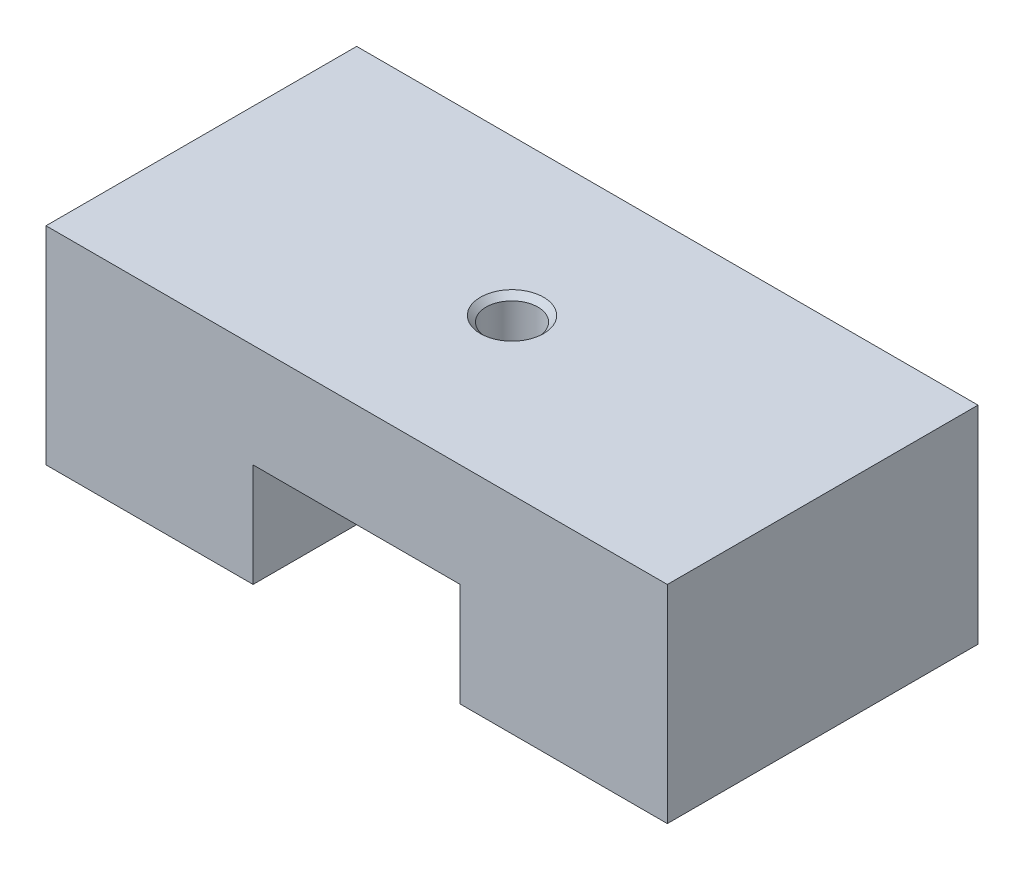
ISO-10303-21;
HEADER;
FILE_DESCRIPTION(('STEP AP214'),'2;1');
FILE_NAME('part.step','',(''),(''),'','','');
FILE_SCHEMA(('AUTOMOTIVE_DESIGN { 1 0 10303 214 1 1 1 1 }'));
ENDSEC;
DATA;
#1=APPLICATION_CONTEXT('core data for automotive mechanical design processes');
#2=APPLICATION_PROTOCOL_DEFINITION('international standard','automotive_design',2000,#1);
#3=PRODUCT_CONTEXT('',#1,'mechanical');
#4=PRODUCT('Part','Part','',(#3));
#5=PRODUCT_RELATED_PRODUCT_CATEGORY('part','',(#4));
#6=PRODUCT_DEFINITION_FORMATION('','',#4);
#7=PRODUCT_DEFINITION_CONTEXT('part definition',#1,'design');
#8=PRODUCT_DEFINITION('design','',#6,#7);
#9=PRODUCT_DEFINITION_SHAPE('','',#8);
#10=(LENGTH_UNIT() NAMED_UNIT(*) SI_UNIT(.MILLI.,.METRE.));
#11=(NAMED_UNIT(*) PLANE_ANGLE_UNIT() SI_UNIT($,.RADIAN.));
#12=(NAMED_UNIT(*) SI_UNIT($,.STERADIAN.) SOLID_ANGLE_UNIT());
#13=UNCERTAINTY_MEASURE_WITH_UNIT(LENGTH_MEASURE(1.E-05),#10,'distance_accuracy_value','');
#14=(GEOMETRIC_REPRESENTATION_CONTEXT(3) GLOBAL_UNCERTAINTY_ASSIGNED_CONTEXT((#13)) GLOBAL_UNIT_ASSIGNED_CONTEXT((#10,
#11,#12)) REPRESENTATION_CONTEXT('',''));
#15=CARTESIAN_POINT('',(0.,0.,0.));
#16=DIRECTION('',(0.,0.,1.));
#17=DIRECTION('',(1.,0.,0.));
#18=AXIS2_PLACEMENT_3D('',#15,#16,#17);
#19=CARTESIAN_POINT('',(15.,0.,15.));
#20=DIRECTION('',(-1.,0.,0.));
#21=DIRECTION('',(0.,-1.,0.));
#22=AXIS2_PLACEMENT_3D('',#19,#20,#21);
#23=PLANE('',#22);
#24=DIRECTION('',(0.,1.,0.));
#25=VECTOR('',#24,1.);
#26=CARTESIAN_POINT('',(15.,0.,0.));
#27=LINE('',#26,#25);
#28=CARTESIAN_POINT('',(15.,-10.,0.));
#29=VERTEX_POINT('',#28);
#30=CARTESIAN_POINT('',(15.,0.,0.));
#31=VERTEX_POINT('',#30);
#32=EDGE_CURVE('E130',#29,#31,#27,.T.);
#33=ORIENTED_EDGE('',*,*,#32,.T.);
#34=DIRECTION('',(0.,0.,-1.));
#35=VECTOR('',#34,1.);
#36=CARTESIAN_POINT('',(15.,0.,15.));
#37=LINE('',#36,#35);
#38=CARTESIAN_POINT('',(15.,0.,15.));
#39=VERTEX_POINT('',#38);
#40=EDGE_CURVE('E11',#39,#31,#37,.T.);
#41=ORIENTED_EDGE('',*,*,#40,.F.);
#42=DIRECTION('',(0.,1.,0.));
#43=VECTOR('',#42,1.);
#44=CARTESIAN_POINT('',(15.,0.,15.));
#45=LINE('',#44,#43);
#46=CARTESIAN_POINT('',(15.,-10.,15.));
#47=VERTEX_POINT('',#46);
#48=EDGE_CURVE('E144',#47,#39,#45,.T.);
#49=ORIENTED_EDGE('',*,*,#48,.F.);
#50=DIRECTION('',(0.,0.,-1.));
#51=VECTOR('',#50,1.);
#52=CARTESIAN_POINT('',(15.,-10.,15.));
#53=LINE('',#52,#51);
#54=EDGE_CURVE('E126',#47,#29,#53,.T.);
#55=ORIENTED_EDGE('',*,*,#54,.T.);
#56=EDGE_LOOP('',(#33,#41,#49,#55));
#57=FACE_BOUND('',#56,.T.);
#58=ADVANCED_FACE('F33',(#57),#23,.F.);
#59=CARTESIAN_POINT('',(-15.,0.,15.));
#60=DIRECTION('',(0.,-1.,0.));
#61=DIRECTION('',(0.,0.,-1.));
#62=AXIS2_PLACEMENT_3D('',#59,#60,#61);
#63=PLANE('',#62);
#64=CARTESIAN_POINT('',(0.,0.,7.5));
#65=DIRECTION('',(0.,1.,0.));
#66=DIRECTION('',(0.,0.,1.));
#67=AXIS2_PLACEMENT_3D('',#64,#65,#66);
#68=CIRCLE('',#67,1.525);
#69=CARTESIAN_POINT('',(0.,0.,9.025));
#70=VERTEX_POINT('',#69);
#71=EDGE_CURVE('E181',#70,#70,#68,.T.);
#72=ORIENTED_EDGE('',*,*,#71,.F.);
#73=EDGE_LOOP('',(#72));
#74=FACE_BOUND('',#73,.T.);
#75=DIRECTION('',(-1.,0.,0.));
#76=VECTOR('',#75,1.);
#77=CARTESIAN_POINT('',(-15.,0.,0.));
#78=LINE('',#77,#76);
#79=CARTESIAN_POINT('',(-15.,0.,0.));
#80=VERTEX_POINT('',#79);
#81=EDGE_CURVE('E133',#31,#80,#78,.T.);
#82=ORIENTED_EDGE('',*,*,#81,.T.);
#83=DIRECTION('',(0.,0.,-1.));
#84=VECTOR('',#83,1.);
#85=CARTESIAN_POINT('',(-15.,0.,15.));
#86=LINE('',#85,#84);
#87=CARTESIAN_POINT('',(-15.,0.,15.));
#88=VERTEX_POINT('',#87);
#89=EDGE_CURVE('E42',#88,#80,#86,.T.);
#90=ORIENTED_EDGE('',*,*,#89,.F.);
#91=DIRECTION('',(-1.,0.,0.));
#92=VECTOR('',#91,1.);
#93=CARTESIAN_POINT('',(-15.,0.,15.));
#94=LINE('',#93,#92);
#95=EDGE_CURVE('E93',#39,#88,#94,.T.);
#96=ORIENTED_EDGE('',*,*,#95,.F.);
#97=ORIENTED_EDGE('',*,*,#40,.T.);
#98=EDGE_LOOP('',(#82,#90,#96,#97));
#99=FACE_BOUND('',#98,.T.);
#100=ADVANCED_FACE('F187',(#74,#99),#63,.F.);
#101=CARTESIAN_POINT('',(-15.,0.,15.));
#102=DIRECTION('',(1.,0.,0.));
#103=DIRECTION('',(0.,1.,0.));
#104=AXIS2_PLACEMENT_3D('',#101,#102,#103);
#105=PLANE('',#104);
#106=DIRECTION('',(0.,-1.,0.));
#107=VECTOR('',#106,1.);
#108=CARTESIAN_POINT('',(-15.,0.,0.));
#109=LINE('',#108,#107);
#110=CARTESIAN_POINT('',(-15.,-10.,0.));
#111=VERTEX_POINT('',#110);
#112=EDGE_CURVE('E135',#80,#111,#109,.T.);
#113=ORIENTED_EDGE('',*,*,#112,.T.);
#114=DIRECTION('',(0.,0.,-1.));
#115=VECTOR('',#114,1.);
#116=CARTESIAN_POINT('',(-15.,-10.,15.));
#117=LINE('',#116,#115);
#118=CARTESIAN_POINT('',(-15.,-10.,15.));
#119=VERTEX_POINT('',#118);
#120=EDGE_CURVE('E151',#119,#111,#117,.T.);
#121=ORIENTED_EDGE('',*,*,#120,.F.);
#122=DIRECTION('',(0.,-1.,0.));
#123=VECTOR('',#122,1.);
#124=CARTESIAN_POINT('',(-15.,0.,15.));
#125=LINE('',#124,#123);
#126=EDGE_CURVE('E160',#88,#119,#125,.T.);
#127=ORIENTED_EDGE('',*,*,#126,.F.);
#128=ORIENTED_EDGE('',*,*,#89,.T.);
#129=EDGE_LOOP('',(#113,#121,#127,#128));
#130=FACE_BOUND('',#129,.T.);
#131=ADVANCED_FACE('F158',(#130),#105,.F.);
#132=CARTESIAN_POINT('',(-15.,-10.,15.));
#133=DIRECTION('',(0.,1.,0.));
#134=DIRECTION('',(-1.,0.,0.));
#135=AXIS2_PLACEMENT_3D('',#132,#133,#134);
#136=PLANE('',#135);
#137=DIRECTION('',(1.,0.,0.));
#138=VECTOR('',#137,1.);
#139=CARTESIAN_POINT('',(-15.,-10.,0.));
#140=LINE('',#139,#138);
#141=CARTESIAN_POINT('',(-5.,-10.,0.));
#142=VERTEX_POINT('',#141);
#143=EDGE_CURVE('E137',#111,#142,#140,.T.);
#144=ORIENTED_EDGE('',*,*,#143,.T.);
#145=DIRECTION('',(0.,0.,-1.));
#146=VECTOR('',#145,1.);
#147=CARTESIAN_POINT('',(-5.,-10.,15.));
#148=LINE('',#147,#146);
#149=CARTESIAN_POINT('',(-5.,-10.,15.));
#150=VERTEX_POINT('',#149);
#151=EDGE_CURVE('E148',#150,#142,#148,.T.);
#152=ORIENTED_EDGE('',*,*,#151,.F.);
#153=DIRECTION('',(1.,0.,0.));
#154=VECTOR('',#153,1.);
#155=CARTESIAN_POINT('',(-15.,-10.,15.));
#156=LINE('',#155,#154);
#157=EDGE_CURVE('E172',#119,#150,#156,.T.);
#158=ORIENTED_EDGE('',*,*,#157,.F.);
#159=ORIENTED_EDGE('',*,*,#120,.T.);
#160=EDGE_LOOP('',(#144,#152,#158,#159));
#161=FACE_BOUND('',#160,.T.);
#162=ADVANCED_FACE('F168',(#161),#136,.F.);
#163=CARTESIAN_POINT('',(-5.,-10.,15.));
#164=DIRECTION('',(-1.,0.,0.));
#165=DIRECTION('',(0.,0.,1.));
#166=AXIS2_PLACEMENT_3D('',#163,#164,#165);
#167=PLANE('',#166);
#168=DIRECTION('',(0.,1.,0.));
#169=VECTOR('',#168,1.);
#170=CARTESIAN_POINT('',(-5.,-10.,0.));
#171=LINE('',#170,#169);
#172=CARTESIAN_POINT('',(-5.,-5.,0.));
#173=VERTEX_POINT('',#172);
#174=EDGE_CURVE('E139',#142,#173,#171,.T.);
#175=ORIENTED_EDGE('',*,*,#174,.T.);
#176=DIRECTION('',(0.,0.,-1.));
#177=VECTOR('',#176,1.);
#178=CARTESIAN_POINT('',(-5.,-5.,15.));
#179=LINE('',#178,#177);
#180=CARTESIAN_POINT('',(-5.,-5.,15.));
#181=VERTEX_POINT('',#180);
#182=EDGE_CURVE('E121',#181,#173,#179,.T.);
#183=ORIENTED_EDGE('',*,*,#182,.F.);
#184=DIRECTION('',(0.,1.,0.));
#185=VECTOR('',#184,1.);
#186=CARTESIAN_POINT('',(-5.,-10.,15.));
#187=LINE('',#186,#185);
#188=EDGE_CURVE('E112',#150,#181,#187,.T.);
#189=ORIENTED_EDGE('',*,*,#188,.F.);
#190=ORIENTED_EDGE('',*,*,#151,.T.);
#191=EDGE_LOOP('',(#175,#183,#189,#190));
#192=FACE_BOUND('',#191,.T.);
#193=ADVANCED_FACE('F171',(#192),#167,.F.);
#194=CARTESIAN_POINT('',(-5.,-5.,15.));
#195=DIRECTION('',(0.,1.,0.));
#196=DIRECTION('',(0.,0.,1.));
#197=AXIS2_PLACEMENT_3D('',#194,#195,#196);
#198=PLANE('',#197);
#199=CARTESIAN_POINT('',(0.,-5.,7.5));
#200=DIRECTION('',(0.,1.,0.));
#201=DIRECTION('',(0.,0.,1.));
#202=AXIS2_PLACEMENT_3D('',#199,#200,#201);
#203=CIRCLE('',#202,1.24999999999999);
#204=CARTESIAN_POINT('',(0.,-5.,8.74999999999999));
#205=VERTEX_POINT('',#204);
#206=EDGE_CURVE('E36',#205,#205,#203,.T.);
#207=ORIENTED_EDGE('',*,*,#206,.T.);
#208=EDGE_LOOP('',(#207));
#209=FACE_BOUND('',#208,.T.);
#210=DIRECTION('',(1.,0.,0.));
#211=VECTOR('',#210,1.);
#212=CARTESIAN_POINT('',(-5.,-5.,0.));
#213=LINE('',#212,#211);
#214=CARTESIAN_POINT('',(4.99999999999999,-5.,0.));
#215=VERTEX_POINT('',#214);
#216=EDGE_CURVE('E120',#173,#215,#213,.T.);
#217=ORIENTED_EDGE('',*,*,#216,.T.);
#218=DIRECTION('',(0.,0.,-1.));
#219=VECTOR('',#218,1.);
#220=CARTESIAN_POINT('',(4.99999999999999,-5.,15.));
#221=LINE('',#220,#219);
#222=CARTESIAN_POINT('',(4.99999999999999,-5.,15.));
#223=VERTEX_POINT('',#222);
#224=EDGE_CURVE('E117',#223,#215,#221,.T.);
#225=ORIENTED_EDGE('',*,*,#224,.F.);
#226=DIRECTION('',(1.,0.,0.));
#227=VECTOR('',#226,1.);
#228=CARTESIAN_POINT('',(-5.,-5.,15.));
#229=LINE('',#228,#227);
#230=EDGE_CURVE('E106',#181,#223,#229,.T.);
#231=ORIENTED_EDGE('',*,*,#230,.F.);
#232=ORIENTED_EDGE('',*,*,#182,.T.);
#233=EDGE_LOOP('',(#217,#225,#231,#232));
#234=FACE_BOUND('',#233,.T.);
#235=ADVANCED_FACE('F118',(#209,#234),#198,.F.);
#236=CARTESIAN_POINT('',(5.,-10.,15.));
#237=DIRECTION('',(1.,0.,0.));
#238=DIRECTION('',(0.,1.,0.));
#239=AXIS2_PLACEMENT_3D('',#236,#237,#238);
#240=PLANE('',#239);
#241=DIRECTION('',(0.,-1.,0.));
#242=VECTOR('',#241,1.);
#243=CARTESIAN_POINT('',(5.,-10.,0.));
#244=LINE('',#243,#242);
#245=CARTESIAN_POINT('',(5.,-10.,0.));
#246=VERTEX_POINT('',#245);
#247=EDGE_CURVE('E79',#215,#246,#244,.T.);
#248=ORIENTED_EDGE('',*,*,#247,.T.);
#249=DIRECTION('',(0.,0.,-1.));
#250=VECTOR('',#249,1.);
#251=CARTESIAN_POINT('',(5.,-10.,15.));
#252=LINE('',#251,#250);
#253=CARTESIAN_POINT('',(5.,-10.,15.));
#254=VERTEX_POINT('',#253);
#255=EDGE_CURVE('E122',#254,#246,#252,.T.);
#256=ORIENTED_EDGE('',*,*,#255,.F.);
#257=DIRECTION('',(0.,-1.,0.));
#258=VECTOR('',#257,1.);
#259=CARTESIAN_POINT('',(5.,-10.,15.));
#260=LINE('',#259,#258);
#261=EDGE_CURVE('E110',#223,#254,#260,.T.);
#262=ORIENTED_EDGE('',*,*,#261,.F.);
#263=ORIENTED_EDGE('',*,*,#224,.T.);
#264=EDGE_LOOP('',(#248,#256,#262,#263));
#265=FACE_BOUND('',#264,.T.);
#266=ADVANCED_FACE('F124',(#265),#240,.F.);
#267=CARTESIAN_POINT('',(15.,-10.,15.));
#268=DIRECTION('',(0.,1.,0.));
#269=DIRECTION('',(0.,0.,1.));
#270=AXIS2_PLACEMENT_3D('',#267,#268,#269);
#271=PLANE('',#270);
#272=DIRECTION('',(1.,0.,0.));
#273=VECTOR('',#272,1.);
#274=CARTESIAN_POINT('',(15.,-10.,0.));
#275=LINE('',#274,#273);
#276=EDGE_CURVE('E85',#246,#29,#275,.T.);
#277=ORIENTED_EDGE('',*,*,#276,.T.);
#278=ORIENTED_EDGE('',*,*,#54,.F.);
#279=DIRECTION('',(1.,0.,0.));
#280=VECTOR('',#279,1.);
#281=CARTESIAN_POINT('',(15.,-10.,15.));
#282=LINE('',#281,#280);
#283=EDGE_CURVE('E50',#254,#47,#282,.T.);
#284=ORIENTED_EDGE('',*,*,#283,.F.);
#285=ORIENTED_EDGE('',*,*,#255,.T.);
#286=EDGE_LOOP('',(#277,#278,#284,#285));
#287=FACE_BOUND('',#286,.T.);
#288=ADVANCED_FACE('F192',(#287),#271,.F.);
#289=CARTESIAN_POINT('',(0.,0.,15.));
#290=DIRECTION('',(0.,0.,-1.));
#291=DIRECTION('',(-1.,0.,0.));
#292=AXIS2_PLACEMENT_3D('',#289,#290,#291);
#293=PLANE('',#292);
#294=ORIENTED_EDGE('',*,*,#48,.T.);
#295=ORIENTED_EDGE('',*,*,#95,.T.);
#296=ORIENTED_EDGE('',*,*,#126,.T.);
#297=ORIENTED_EDGE('',*,*,#157,.T.);
#298=ORIENTED_EDGE('',*,*,#188,.T.);
#299=ORIENTED_EDGE('',*,*,#230,.T.);
#300=ORIENTED_EDGE('',*,*,#261,.T.);
#301=ORIENTED_EDGE('',*,*,#283,.T.);
#302=EDGE_LOOP('',(#294,#295,#296,#297,#298,#299,#300,#301));
#303=FACE_BOUND('',#302,.T.);
#304=ADVANCED_FACE('F108',(#303),#293,.F.);
#305=CARTESIAN_POINT('',(0.,0.,0.));
#306=DIRECTION('',(0.,0.,-1.));
#307=DIRECTION('',(-1.,0.,0.));
#308=AXIS2_PLACEMENT_3D('',#305,#306,#307);
#309=PLANE('',#308);
#310=ORIENTED_EDGE('',*,*,#32,.F.);
#311=ORIENTED_EDGE('',*,*,#276,.F.);
#312=ORIENTED_EDGE('',*,*,#247,.F.);
#313=ORIENTED_EDGE('',*,*,#216,.F.);
#314=ORIENTED_EDGE('',*,*,#174,.F.);
#315=ORIENTED_EDGE('',*,*,#143,.F.);
#316=ORIENTED_EDGE('',*,*,#112,.F.);
#317=ORIENTED_EDGE('',*,*,#81,.F.);
#318=EDGE_LOOP('',(#310,#311,#312,#313,#314,#315,#316,#317));
#319=FACE_BOUND('',#318,.T.);
#320=ADVANCED_FACE('F164',(#319),#309,.T.);
#321=CARTESIAN_POINT('',(0.,0.,7.5));
#322=DIRECTION('',(0.,1.,0.));
#323=DIRECTION('',(0.,0.,1.));
#324=AXIS2_PLACEMENT_3D('',#321,#322,#323);
#325=CYLINDRICAL_SURFACE('',#324,1.24999999999999);
#326=CARTESIAN_POINT('',(0.,-0.275000000000011,7.5));
#327=DIRECTION('',(0.,1.,0.));
#328=DIRECTION('',(0.,0.,1.));
#329=AXIS2_PLACEMENT_3D('',#326,#327,#328);
#330=CIRCLE('',#329,1.24999999999999);
#331=CARTESIAN_POINT('',(0.,-0.275000000000011,8.74999999999999));
#332=VERTEX_POINT('',#331);
#333=EDGE_CURVE('E178',#332,#332,#330,.T.);
#334=ORIENTED_EDGE('',*,*,#333,.T.);
#335=EDGE_LOOP('',(#334));
#336=FACE_BOUND('',#335,.T.);
#337=ORIENTED_EDGE('',*,*,#206,.F.);
#338=EDGE_LOOP('',(#337));
#339=FACE_BOUND('',#338,.T.);
#340=ADVANCED_FACE('F257',(#336,#339),#325,.F.);
#341=CARTESIAN_POINT('',(0.,0.,7.5));
#342=DIRECTION('',(0.,1.,0.));
#343=DIRECTION('',(0.,0.,1.));
#344=AXIS2_PLACEMENT_3D('',#341,#342,#343);
#345=CONICAL_SURFACE('',#344,1.525,0.785398163397448);
#346=ORIENTED_EDGE('',*,*,#333,.F.);
#347=EDGE_LOOP('',(#346));
#348=FACE_BOUND('',#347,.T.);
#349=ORIENTED_EDGE('',*,*,#71,.T.);
#350=EDGE_LOOP('',(#349));
#351=FACE_BOUND('',#350,.T.);
#352=ADVANCED_FACE('F185',(#348,#351),#345,.F.);
#353=CLOSED_SHELL('',(#58,#100,#131,#162,#193,#235,#266,#288,#304,#320,#340,#352));
#354=MANIFOLD_SOLID_BREP('B2',#353);
#355=ADVANCED_BREP_SHAPE_REPRESENTATION('',(#18,#354),#14);
#356=SHAPE_DEFINITION_REPRESENTATION(#9,#355);
ENDSEC;
END-ISO-10303-21;
